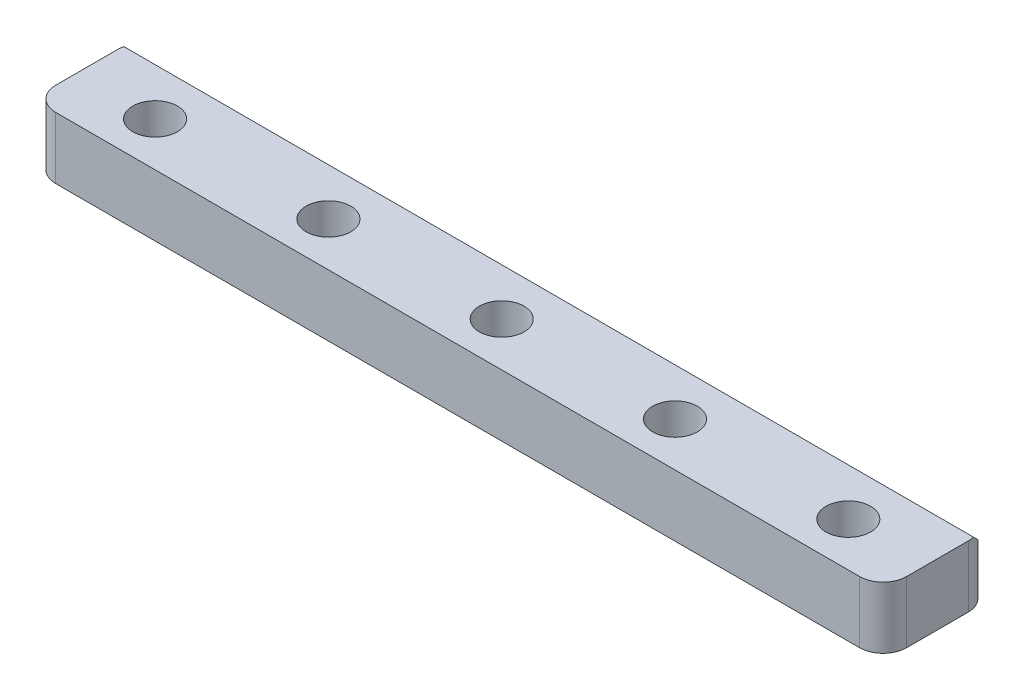
ISO-10303-21;
HEADER;
FILE_DESCRIPTION(('STEP AP214'),'2;1');
FILE_NAME('part.step','',(''),(''),'','','');
FILE_SCHEMA(('AUTOMOTIVE_DESIGN { 1 0 10303 214 1 1 1 1 }'));
ENDSEC;
DATA;
#1=APPLICATION_CONTEXT('core data for automotive mechanical design processes');
#2=APPLICATION_PROTOCOL_DEFINITION('international standard','automotive_design',2000,#1);
#3=PRODUCT_CONTEXT('',#1,'mechanical');
#4=PRODUCT('Part','Part','',(#3));
#5=PRODUCT_RELATED_PRODUCT_CATEGORY('part','',(#4));
#6=PRODUCT_DEFINITION_FORMATION('','',#4);
#7=PRODUCT_DEFINITION_CONTEXT('part definition',#1,'design');
#8=PRODUCT_DEFINITION('design','',#6,#7);
#9=PRODUCT_DEFINITION_SHAPE('','',#8);
#10=(LENGTH_UNIT() NAMED_UNIT(*) SI_UNIT(.MILLI.,.METRE.));
#11=(NAMED_UNIT(*) PLANE_ANGLE_UNIT() SI_UNIT($,.RADIAN.));
#12=(NAMED_UNIT(*) SI_UNIT($,.STERADIAN.) SOLID_ANGLE_UNIT());
#13=UNCERTAINTY_MEASURE_WITH_UNIT(LENGTH_MEASURE(1.E-05),#10,'distance_accuracy_value','');
#14=(GEOMETRIC_REPRESENTATION_CONTEXT(3) GLOBAL_UNCERTAINTY_ASSIGNED_CONTEXT((#13)) GLOBAL_UNIT_ASSIGNED_CONTEXT((#10,
#11,#12)) REPRESENTATION_CONTEXT('',''));
#15=CARTESIAN_POINT('',(0.,0.,0.));
#16=DIRECTION('',(0.,0.,1.));
#17=DIRECTION('',(1.,0.,0.));
#18=AXIS2_PLACEMENT_3D('',#15,#16,#17);
#19=CARTESIAN_POINT('',(34.2094010767586,5.25,-3.5));
#20=DIRECTION('',(0.,-1.,0.));
#21=DIRECTION('',(0.,0.,-1.));
#22=AXIS2_PLACEMENT_3D('',#19,#20,#21);
#23=PLANE('',#22);
#24=CARTESIAN_POINT('',(-14.7480762113533,5.25,0.));
#25=DIRECTION('',(0.,1.,0.));
#26=DIRECTION('',(0.,0.,1.));
#27=AXIS2_PLACEMENT_3D('',#24,#25,#26);
#28=CIRCLE('',#27,1.9);
#29=CARTESIAN_POINT('',(-14.7480762113533,5.25,-1.9));
#30=VERTEX_POINT('',#29);
#31=EDGE_CURVE('E343',#30,#30,#28,.T.);
#32=ORIENTED_EDGE('',*,*,#31,.F.);
#33=EDGE_LOOP('',(#32));
#34=FACE_BOUND('',#33,.T.);
#35=CARTESIAN_POINT('',(14.7480762113534,5.25,0.));
#36=DIRECTION('',(0.,1.,0.));
#37=DIRECTION('',(0.,0.,1.));
#38=AXIS2_PLACEMENT_3D('',#35,#36,#37);
#39=CIRCLE('',#38,1.9);
#40=CARTESIAN_POINT('',(14.7480762113534,5.25,-1.9));
#41=VERTEX_POINT('',#40);
#42=EDGE_CURVE('E362',#41,#41,#39,.T.);
#43=ORIENTED_EDGE('',*,*,#42,.F.);
#44=EDGE_LOOP('',(#43));
#45=FACE_BOUND('',#44,.T.);
#46=CARTESIAN_POINT('',(34.2094010767586,5.25,-3.5));
#47=DIRECTION('',(0.,1.,0.));
#48=DIRECTION('',(0.,0.,-1.));
#49=AXIS2_PLACEMENT_3D('',#46,#47,#48);
#50=CIRCLE('',#49,2.);
#51=CARTESIAN_POINT('',(36.2094010767586,5.25,-3.5));
#52=VERTEX_POINT('',#51);
#53=CARTESIAN_POINT('',(36.1458927498623,5.25,-4.00000000000001));
#54=VERTEX_POINT('',#53);
#55=EDGE_CURVE('E110',#52,#54,#50,.T.);
#56=ORIENTED_EDGE('',*,*,#55,.T.);
#57=DIRECTION('',(-1.,0.,0.));
#58=VECTOR('',#57,1.);
#59=CARTESIAN_POINT('',(34.2094010767586,5.25,-4.00000000000001));
#60=LINE('',#59,#58);
#61=CARTESIAN_POINT('',(-36.1458927498623,5.25,-4.));
#62=VERTEX_POINT('',#61);
#63=EDGE_CURVE('E109',#54,#62,#60,.T.);
#64=ORIENTED_EDGE('',*,*,#63,.T.);
#65=CARTESIAN_POINT('',(-34.2094010767586,5.25,-3.5));
#66=DIRECTION('',(0.,1.,0.));
#67=DIRECTION('',(0.,0.,1.));
#68=AXIS2_PLACEMENT_3D('',#65,#66,#67);
#69=CIRCLE('',#68,2.);
#70=CARTESIAN_POINT('',(-36.2094010767586,5.25,-3.5));
#71=VERTEX_POINT('',#70);
#72=EDGE_CURVE('E101',#62,#71,#69,.T.);
#73=ORIENTED_EDGE('',*,*,#72,.T.);
#74=DIRECTION('',(0.,0.,1.));
#75=VECTOR('',#74,1.);
#76=CARTESIAN_POINT('',(-36.2094010767586,5.25,-3.49999999999999));
#77=LINE('',#76,#75);
#78=CARTESIAN_POINT('',(-36.2094010767586,5.25,1.75));
#79=VERTEX_POINT('',#78);
#80=EDGE_CURVE('E106',#71,#79,#77,.T.);
#81=ORIENTED_EDGE('',*,*,#80,.T.);
#82=CARTESIAN_POINT('',(-34.2094010767586,5.25,1.75));
#83=DIRECTION('',(0.,1.,0.));
#84=DIRECTION('',(0.,0.,-1.));
#85=AXIS2_PLACEMENT_3D('',#82,#83,#84);
#86=CIRCLE('',#85,2.);
#87=CARTESIAN_POINT('',(-34.2094010767586,5.25,3.75));
#88=VERTEX_POINT('',#87);
#89=EDGE_CURVE('E125',#79,#88,#86,.T.);
#90=ORIENTED_EDGE('',*,*,#89,.T.);
#91=DIRECTION('',(1.,0.,0.));
#92=VECTOR('',#91,1.);
#93=CARTESIAN_POINT('',(-34.2094010767586,5.25,3.75));
#94=LINE('',#93,#92);
#95=CARTESIAN_POINT('',(34.2094010767586,5.25,3.75));
#96=VERTEX_POINT('',#95);
#97=EDGE_CURVE('E127',#88,#96,#94,.T.);
#98=ORIENTED_EDGE('',*,*,#97,.T.);
#99=CARTESIAN_POINT('',(34.2094010767586,5.25,1.75));
#100=DIRECTION('',(0.,1.,0.));
#101=DIRECTION('',(0.,0.,-1.));
#102=AXIS2_PLACEMENT_3D('',#99,#100,#101);
#103=CIRCLE('',#102,2.);
#104=CARTESIAN_POINT('',(36.2094010767586,5.25,1.75));
#105=VERTEX_POINT('',#104);
#106=EDGE_CURVE('E132',#96,#105,#103,.T.);
#107=ORIENTED_EDGE('',*,*,#106,.T.);
#108=DIRECTION('',(0.,0.,-1.));
#109=VECTOR('',#108,1.);
#110=CARTESIAN_POINT('',(36.2094010767586,5.25,-3.5));
#111=LINE('',#110,#109);
#112=EDGE_CURVE('E134',#105,#52,#111,.T.);
#113=ORIENTED_EDGE('',*,*,#112,.T.);
#114=EDGE_LOOP('',(#56,#64,#73,#81,#90,#98,#107,#113));
#115=FACE_BOUND('',#114,.T.);
#116=CARTESIAN_POINT('',(29.4980762113534,5.25,0.));
#117=DIRECTION('',(0.,1.,0.));
#118=DIRECTION('',(0.,0.,1.));
#119=AXIS2_PLACEMENT_3D('',#116,#117,#118);
#120=CIRCLE('',#119,1.9);
#121=CARTESIAN_POINT('',(29.4980762113534,5.25,-1.9));
#122=VERTEX_POINT('',#121);
#123=EDGE_CURVE('E141',#122,#122,#120,.T.);
#124=ORIENTED_EDGE('',*,*,#123,.F.);
#125=EDGE_LOOP('',(#124));
#126=FACE_BOUND('',#125,.T.);
#127=CARTESIAN_POINT('',(0.,5.25,0.));
#128=DIRECTION('',(0.,1.,0.));
#129=DIRECTION('',(0.,0.,1.));
#130=AXIS2_PLACEMENT_3D('',#127,#128,#129);
#131=CIRCLE('',#130,1.9);
#132=CARTESIAN_POINT('',(0.,5.25,-1.9));
#133=VERTEX_POINT('',#132);
#134=EDGE_CURVE('E356',#133,#133,#131,.T.);
#135=ORIENTED_EDGE('',*,*,#134,.F.);
#136=EDGE_LOOP('',(#135));
#137=FACE_BOUND('',#136,.T.);
#138=CARTESIAN_POINT('',(-29.4980762113533,5.25,0.));
#139=DIRECTION('',(0.,1.,0.));
#140=DIRECTION('',(0.,0.,1.));
#141=AXIS2_PLACEMENT_3D('',#138,#139,#140);
#142=CIRCLE('',#141,1.89999999999999);
#143=CARTESIAN_POINT('',(-29.4980762113533,5.25,-1.89999999999999));
#144=VERTEX_POINT('',#143);
#145=EDGE_CURVE('E347',#144,#144,#142,.T.);
#146=ORIENTED_EDGE('',*,*,#145,.F.);
#147=EDGE_LOOP('',(#146));
#148=FACE_BOUND('',#147,.T.);
#149=ADVANCED_FACE('F33',(#34,#45,#115,#126,#137,#148),#23,.F.);
#150=CARTESIAN_POINT('',(34.2094010767586,0.,-3.5));
#151=DIRECTION('',(0.,-1.,0.));
#152=DIRECTION('',(0.,0.,-1.));
#153=AXIS2_PLACEMENT_3D('',#150,#151,#152);
#154=PLANE('',#153);
#155=CARTESIAN_POINT('',(-14.7480762113533,0.,0.));
#156=DIRECTION('',(0.,1.,0.));
#157=DIRECTION('',(0.,0.,1.));
#158=AXIS2_PLACEMENT_3D('',#155,#156,#157);
#159=CIRCLE('',#158,1.9);
#160=CARTESIAN_POINT('',(-14.7480762113533,0.,-1.9));
#161=VERTEX_POINT('',#160);
#162=EDGE_CURVE('E346',#161,#161,#159,.T.);
#163=ORIENTED_EDGE('',*,*,#162,.T.);
#164=EDGE_LOOP('',(#163));
#165=FACE_BOUND('',#164,.T.);
#166=CARTESIAN_POINT('',(14.7480762113534,0.,0.));
#167=DIRECTION('',(0.,1.,0.));
#168=DIRECTION('',(0.,0.,1.));
#169=AXIS2_PLACEMENT_3D('',#166,#167,#168);
#170=CIRCLE('',#169,1.9);
#171=CARTESIAN_POINT('',(14.7480762113534,0.,-1.9));
#172=VERTEX_POINT('',#171);
#173=EDGE_CURVE('E359',#172,#172,#170,.T.);
#174=ORIENTED_EDGE('',*,*,#173,.T.);
#175=EDGE_LOOP('',(#174));
#176=FACE_BOUND('',#175,.T.);
#177=CARTESIAN_POINT('',(34.2094010767586,0.,-3.5));
#178=DIRECTION('',(0.,1.,0.));
#179=DIRECTION('',(0.,0.,-1.));
#180=AXIS2_PLACEMENT_3D('',#177,#178,#179);
#181=CIRCLE('',#180,2.);
#182=CARTESIAN_POINT('',(36.2094010767586,0.,-3.5));
#183=VERTEX_POINT('',#182);
#184=CARTESIAN_POINT('',(34.2094010767586,0.,-5.50000000000001));
#185=VERTEX_POINT('',#184);
#186=EDGE_CURVE('E137',#183,#185,#181,.T.);
#187=ORIENTED_EDGE('',*,*,#186,.F.);
#188=DIRECTION('',(0.,0.,-1.));
#189=VECTOR('',#188,1.);
#190=CARTESIAN_POINT('',(36.2094010767586,0.,-3.5));
#191=LINE('',#190,#189);
#192=CARTESIAN_POINT('',(36.2094010767586,0.,1.75));
#193=VERTEX_POINT('',#192);
#194=EDGE_CURVE('E153',#193,#183,#191,.T.);
#195=ORIENTED_EDGE('',*,*,#194,.F.);
#196=CARTESIAN_POINT('',(34.2094010767586,0.,1.75));
#197=DIRECTION('',(0.,1.,0.));
#198=DIRECTION('',(0.,0.,-1.));
#199=AXIS2_PLACEMENT_3D('',#196,#197,#198);
#200=CIRCLE('',#199,2.);
#201=CARTESIAN_POINT('',(34.2094010767586,0.,3.75));
#202=VERTEX_POINT('',#201);
#203=EDGE_CURVE('E151',#202,#193,#200,.T.);
#204=ORIENTED_EDGE('',*,*,#203,.F.);
#205=DIRECTION('',(1.,0.,0.));
#206=VECTOR('',#205,1.);
#207=CARTESIAN_POINT('',(-34.2094010767586,0.,3.75));
#208=LINE('',#207,#206);
#209=CARTESIAN_POINT('',(-34.2094010767586,0.,3.75));
#210=VERTEX_POINT('',#209);
#211=EDGE_CURVE('E149',#210,#202,#208,.T.);
#212=ORIENTED_EDGE('',*,*,#211,.F.);
#213=CARTESIAN_POINT('',(-34.2094010767586,0.,1.75));
#214=DIRECTION('',(0.,1.,0.));
#215=DIRECTION('',(0.,0.,-1.));
#216=AXIS2_PLACEMENT_3D('',#213,#214,#215);
#217=CIRCLE('',#216,2.);
#218=CARTESIAN_POINT('',(-36.2094010767586,0.,1.75));
#219=VERTEX_POINT('',#218);
#220=EDGE_CURVE('E147',#219,#210,#217,.T.);
#221=ORIENTED_EDGE('',*,*,#220,.F.);
#222=DIRECTION('',(0.,0.,1.));
#223=VECTOR('',#222,1.);
#224=CARTESIAN_POINT('',(-36.2094010767586,0.,-3.49999999999999));
#225=LINE('',#224,#223);
#226=CARTESIAN_POINT('',(-36.2094010767586,0.,-3.5));
#227=VERTEX_POINT('',#226);
#228=EDGE_CURVE('E145',#227,#219,#225,.T.);
#229=ORIENTED_EDGE('',*,*,#228,.F.);
#230=CARTESIAN_POINT('',(-34.2094010767586,0.,-3.5));
#231=DIRECTION('',(0.,1.,0.));
#232=DIRECTION('',(0.,0.,1.));
#233=AXIS2_PLACEMENT_3D('',#230,#231,#232);
#234=CIRCLE('',#233,2.);
#235=CARTESIAN_POINT('',(-34.2094010767586,0.,-5.5));
#236=VERTEX_POINT('',#235);
#237=EDGE_CURVE('E116',#236,#227,#234,.T.);
#238=ORIENTED_EDGE('',*,*,#237,.F.);
#239=DIRECTION('',(-1.,0.,0.));
#240=VECTOR('',#239,1.);
#241=CARTESIAN_POINT('',(34.2094010767586,0.,-5.50000000000001));
#242=LINE('',#241,#240);
#243=EDGE_CURVE('E140',#185,#236,#242,.T.);
#244=ORIENTED_EDGE('',*,*,#243,.F.);
#245=EDGE_LOOP('',(#187,#195,#204,#212,#221,#229,#238,#244));
#246=FACE_BOUND('',#245,.T.);
#247=CARTESIAN_POINT('',(29.4980762113534,0.,0.));
#248=DIRECTION('',(0.,1.,0.));
#249=DIRECTION('',(0.,0.,1.));
#250=AXIS2_PLACEMENT_3D('',#247,#248,#249);
#251=CIRCLE('',#250,1.9);
#252=CARTESIAN_POINT('',(29.4980762113534,0.,-1.9));
#253=VERTEX_POINT('',#252);
#254=EDGE_CURVE('E365',#253,#253,#251,.T.);
#255=ORIENTED_EDGE('',*,*,#254,.T.);
#256=EDGE_LOOP('',(#255));
#257=FACE_BOUND('',#256,.T.);
#258=CARTESIAN_POINT('',(0.,0.,0.));
#259=DIRECTION('',(0.,1.,0.));
#260=DIRECTION('',(0.,0.,1.));
#261=AXIS2_PLACEMENT_3D('',#258,#259,#260);
#262=CIRCLE('',#261,1.9);
#263=CARTESIAN_POINT('',(0.,0.,-1.9));
#264=VERTEX_POINT('',#263);
#265=EDGE_CURVE('E349',#264,#264,#262,.T.);
#266=ORIENTED_EDGE('',*,*,#265,.T.);
#267=EDGE_LOOP('',(#266));
#268=FACE_BOUND('',#267,.T.);
#269=CARTESIAN_POINT('',(-29.4980762113533,0.,0.));
#270=DIRECTION('',(0.,1.,0.));
#271=DIRECTION('',(0.,0.,1.));
#272=AXIS2_PLACEMENT_3D('',#269,#270,#271);
#273=CIRCLE('',#272,1.89999999999999);
#274=CARTESIAN_POINT('',(-29.4980762113533,0.,-1.89999999999999));
#275=VERTEX_POINT('',#274);
#276=EDGE_CURVE('E352',#275,#275,#273,.T.);
#277=ORIENTED_EDGE('',*,*,#276,.T.);
#278=EDGE_LOOP('',(#277));
#279=FACE_BOUND('',#278,.T.);
#280=ADVANCED_FACE('F177',(#165,#176,#246,#257,#268,#279),#154,.T.);
#281=CARTESIAN_POINT('',(34.2094010767586,5.25,-3.5));
#282=DIRECTION('',(0.,-1.,0.));
#283=DIRECTION('',(0.,0.,-1.));
#284=AXIS2_PLACEMENT_3D('',#281,#282,#283);
#285=CYLINDRICAL_SURFACE('',#284,2.);
#286=DIRECTION('',(0.,-1.,0.));
#287=VECTOR('',#286,1.);
#288=CARTESIAN_POINT('',(34.2094010767586,5.25,-5.50000000000001));
#289=LINE('',#288,#287);
#290=CARTESIAN_POINT('',(34.2094010767586,3.75000000000001,-5.50000000000001));
#291=VERTEX_POINT('',#290);
#292=EDGE_CURVE('E168',#291,#185,#289,.T.);
#293=ORIENTED_EDGE('',*,*,#292,.F.);
#294=CARTESIAN_POINT('',(34.2094010767586,5.75000000000001,-3.5));
#295=DIRECTION('',(0.,-0.707106781186548,0.707106781186548));
#296=DIRECTION('',(0.,-0.707106781186548,-0.707106781186548));
#297=AXIS2_PLACEMENT_3D('',#294,#295,#296);
#298=ELLIPSE('',#297,2.82842712474619,2.);
#299=EDGE_CURVE('E11',#291,#54,#298,.T.);
#300=ORIENTED_EDGE('',*,*,#299,.T.);
#301=ORIENTED_EDGE('',*,*,#55,.F.);
#302=DIRECTION('',(0.,-1.,0.));
#303=VECTOR('',#302,1.);
#304=CARTESIAN_POINT('',(36.2094010767586,5.25,-3.5));
#305=LINE('',#304,#303);
#306=EDGE_CURVE('E136',#52,#183,#305,.T.);
#307=ORIENTED_EDGE('',*,*,#306,.T.);
#308=ORIENTED_EDGE('',*,*,#186,.T.);
#309=EDGE_LOOP('',(#293,#300,#301,#307,#308));
#310=FACE_BOUND('',#309,.T.);
#311=ADVANCED_FACE('F180',(#310),#285,.T.);
#312=CARTESIAN_POINT('',(34.2094010767586,5.25,-5.50000000000001));
#313=DIRECTION('',(0.,0.,1.));
#314=DIRECTION('',(1.,0.,0.));
#315=AXIS2_PLACEMENT_3D('',#312,#313,#314);
#316=PLANE('',#315);
#317=DIRECTION('',(0.,-1.,0.));
#318=VECTOR('',#317,1.);
#319=CARTESIAN_POINT('',(-34.2094010767586,5.25,-5.5));
#320=LINE('',#319,#318);
#321=CARTESIAN_POINT('',(-34.2094010767586,3.75000000000001,-5.5));
#322=VERTEX_POINT('',#321);
#323=EDGE_CURVE('E119',#322,#236,#320,.T.);
#324=ORIENTED_EDGE('',*,*,#323,.F.);
#325=DIRECTION('',(1.,0.,0.));
#326=VECTOR('',#325,1.);
#327=CARTESIAN_POINT('',(34.2094010767586,3.75000000000001,-5.50000000000001));
#328=LINE('',#327,#326);
#329=EDGE_CURVE('E41',#322,#291,#328,.T.);
#330=ORIENTED_EDGE('',*,*,#329,.T.);
#331=ORIENTED_EDGE('',*,*,#292,.T.);
#332=ORIENTED_EDGE('',*,*,#243,.T.);
#333=EDGE_LOOP('',(#324,#330,#331,#332));
#334=FACE_BOUND('',#333,.T.);
#335=ADVANCED_FACE('F172',(#334),#316,.F.);
#336=CARTESIAN_POINT('',(-34.2094010767586,5.25,-3.5));
#337=DIRECTION('',(0.,-1.,0.));
#338=DIRECTION('',(0.,0.,-1.));
#339=AXIS2_PLACEMENT_3D('',#336,#337,#338);
#340=CYLINDRICAL_SURFACE('',#339,2.);
#341=ORIENTED_EDGE('',*,*,#72,.F.);
#342=CARTESIAN_POINT('',(-34.2094010767586,5.75000000000001,-3.5));
#343=DIRECTION('',(0.,-0.707106781186548,0.707106781186548));
#344=DIRECTION('',(0.,-0.707106781186548,-0.707106781186548));
#345=AXIS2_PLACEMENT_3D('',#342,#343,#344);
#346=ELLIPSE('',#345,2.82842712474619,2.);
#347=EDGE_CURVE('E55',#62,#322,#346,.T.);
#348=ORIENTED_EDGE('',*,*,#347,.T.);
#349=ORIENTED_EDGE('',*,*,#323,.T.);
#350=ORIENTED_EDGE('',*,*,#237,.T.);
#351=DIRECTION('',(0.,-1.,0.));
#352=VECTOR('',#351,1.);
#353=CARTESIAN_POINT('',(-36.2094010767586,5.25,-3.5));
#354=LINE('',#353,#352);
#355=EDGE_CURVE('E113',#71,#227,#354,.T.);
#356=ORIENTED_EDGE('',*,*,#355,.F.);
#357=EDGE_LOOP('',(#341,#348,#349,#350,#356));
#358=FACE_BOUND('',#357,.T.);
#359=ADVANCED_FACE('F114',(#358),#340,.T.);
#360=CARTESIAN_POINT('',(-36.2094010767586,5.25,-3.49999999999999));
#361=DIRECTION('',(1.,0.,0.));
#362=DIRECTION('',(0.,0.,-1.));
#363=AXIS2_PLACEMENT_3D('',#360,#361,#362);
#364=PLANE('',#363);
#365=ORIENTED_EDGE('',*,*,#228,.T.);
#366=DIRECTION('',(0.,-1.,0.));
#367=VECTOR('',#366,1.);
#368=CARTESIAN_POINT('',(-36.2094010767586,5.25,1.75));
#369=LINE('',#368,#367);
#370=EDGE_CURVE('E120',#79,#219,#369,.T.);
#371=ORIENTED_EDGE('',*,*,#370,.F.);
#372=ORIENTED_EDGE('',*,*,#80,.F.);
#373=ORIENTED_EDGE('',*,*,#355,.T.);
#374=EDGE_LOOP('',(#365,#371,#372,#373));
#375=FACE_BOUND('',#374,.T.);
#376=ADVANCED_FACE('F122',(#375),#364,.F.);
#377=CARTESIAN_POINT('',(-34.2094010767586,5.25,1.75));
#378=DIRECTION('',(0.,-1.,0.));
#379=DIRECTION('',(0.,0.,-1.));
#380=AXIS2_PLACEMENT_3D('',#377,#378,#379);
#381=CYLINDRICAL_SURFACE('',#380,2.);
#382=ORIENTED_EDGE('',*,*,#220,.T.);
#383=DIRECTION('',(0.,-1.,0.));
#384=VECTOR('',#383,1.);
#385=CARTESIAN_POINT('',(-34.2094010767586,5.25,3.75));
#386=LINE('',#385,#384);
#387=EDGE_CURVE('E163',#88,#210,#386,.T.);
#388=ORIENTED_EDGE('',*,*,#387,.F.);
#389=ORIENTED_EDGE('',*,*,#89,.F.);
#390=ORIENTED_EDGE('',*,*,#370,.T.);
#391=EDGE_LOOP('',(#382,#388,#389,#390));
#392=FACE_BOUND('',#391,.T.);
#393=ADVANCED_FACE('F199',(#392),#381,.T.);
#394=CARTESIAN_POINT('',(-34.2094010767586,5.25,3.75));
#395=DIRECTION('',(0.,0.,-1.));
#396=DIRECTION('',(-1.,0.,0.));
#397=AXIS2_PLACEMENT_3D('',#394,#395,#396);
#398=PLANE('',#397);
#399=ORIENTED_EDGE('',*,*,#211,.T.);
#400=DIRECTION('',(0.,-1.,0.));
#401=VECTOR('',#400,1.);
#402=CARTESIAN_POINT('',(34.2094010767586,5.25,3.75));
#403=LINE('',#402,#401);
#404=EDGE_CURVE('E160',#96,#202,#403,.T.);
#405=ORIENTED_EDGE('',*,*,#404,.F.);
#406=ORIENTED_EDGE('',*,*,#97,.F.);
#407=ORIENTED_EDGE('',*,*,#387,.T.);
#408=EDGE_LOOP('',(#399,#405,#406,#407));
#409=FACE_BOUND('',#408,.T.);
#410=ADVANCED_FACE('F196',(#409),#398,.F.);
#411=CARTESIAN_POINT('',(34.2094010767586,5.25,1.75));
#412=DIRECTION('',(0.,-1.,0.));
#413=DIRECTION('',(0.,0.,-1.));
#414=AXIS2_PLACEMENT_3D('',#411,#412,#413);
#415=CYLINDRICAL_SURFACE('',#414,2.);
#416=ORIENTED_EDGE('',*,*,#203,.T.);
#417=DIRECTION('',(0.,-1.,0.));
#418=VECTOR('',#417,1.);
#419=CARTESIAN_POINT('',(36.2094010767586,5.25,1.75));
#420=LINE('',#419,#418);
#421=EDGE_CURVE('E157',#105,#193,#420,.T.);
#422=ORIENTED_EDGE('',*,*,#421,.F.);
#423=ORIENTED_EDGE('',*,*,#106,.F.);
#424=ORIENTED_EDGE('',*,*,#404,.T.);
#425=EDGE_LOOP('',(#416,#422,#423,#424));
#426=FACE_BOUND('',#425,.T.);
#427=ADVANCED_FACE('F191',(#426),#415,.T.);
#428=CARTESIAN_POINT('',(36.2094010767586,5.25,-3.5));
#429=DIRECTION('',(-1.,0.,0.));
#430=DIRECTION('',(0.,0.,1.));
#431=AXIS2_PLACEMENT_3D('',#428,#429,#430);
#432=PLANE('',#431);
#433=ORIENTED_EDGE('',*,*,#194,.T.);
#434=ORIENTED_EDGE('',*,*,#306,.F.);
#435=ORIENTED_EDGE('',*,*,#112,.F.);
#436=ORIENTED_EDGE('',*,*,#421,.T.);
#437=EDGE_LOOP('',(#433,#434,#435,#436));
#438=FACE_BOUND('',#437,.T.);
#439=ADVANCED_FACE('F185',(#438),#432,.F.);
#440=CARTESIAN_POINT('',(29.4980762113534,5.25,0.));
#441=DIRECTION('',(0.,-1.,0.));
#442=DIRECTION('',(0.,0.,-1.));
#443=AXIS2_PLACEMENT_3D('',#440,#441,#442);
#444=CYLINDRICAL_SURFACE('',#443,1.9);
#445=CARTESIAN_POINT('',(29.4980762113534,5.25,-1.9));
#446=CARTESIAN_POINT('',(29.4980762113534,5.1953125,-1.9));
#447=CARTESIAN_POINT('',(29.4980762113534,5.140625,-1.9));
#448=CARTESIAN_POINT('',(29.4980762113534,5.03125,-1.9));
#449=CARTESIAN_POINT('',(29.4980762113534,4.9765625,-1.9));
#450=CARTESIAN_POINT('',(29.4980762113534,4.8671875,-1.9));
#451=CARTESIAN_POINT('',(29.4980762113534,4.8125,-1.9));
#452=CARTESIAN_POINT('',(29.4980762113534,4.703125,-1.9));
#453=CARTESIAN_POINT('',(29.4980762113534,4.6484375,-1.9));
#454=CARTESIAN_POINT('',(29.4980762113534,4.5390625,-1.9));
#455=CARTESIAN_POINT('',(29.4980762113534,4.484375,-1.9));
#456=CARTESIAN_POINT('',(29.4980762113534,4.375,-1.9));
#457=CARTESIAN_POINT('',(29.4980762113534,4.3203125,-1.9));
#458=CARTESIAN_POINT('',(29.4980762113534,4.2109375,-1.9));
#459=CARTESIAN_POINT('',(29.4980762113534,4.15625,-1.9));
#460=CARTESIAN_POINT('',(29.4980762113534,4.046875,-1.9));
#461=CARTESIAN_POINT('',(29.4980762113534,3.9921875,-1.9));
#462=CARTESIAN_POINT('',(29.4980762113534,3.8828125,-1.9));
#463=CARTESIAN_POINT('',(29.4980762113534,3.828125,-1.9));
#464=CARTESIAN_POINT('',(29.4980762113534,3.71875,-1.9));
#465=CARTESIAN_POINT('',(29.4980762113534,3.6640625,-1.9));
#466=CARTESIAN_POINT('',(29.4980762113534,3.5546875,-1.9));
#467=CARTESIAN_POINT('',(29.4980762113534,3.5,-1.9));
#468=CARTESIAN_POINT('',(29.4980762113534,3.390625,-1.9));
#469=CARTESIAN_POINT('',(29.4980762113534,3.3359375,-1.9));
#470=CARTESIAN_POINT('',(29.4980762113534,3.2265625,-1.9));
#471=CARTESIAN_POINT('',(29.4980762113534,3.171875,-1.9));
#472=CARTESIAN_POINT('',(29.4980762113534,3.0625,-1.9));
#473=CARTESIAN_POINT('',(29.4980762113534,3.0078125,-1.9));
#474=CARTESIAN_POINT('',(29.4980762113534,2.8984375,-1.9));
#475=CARTESIAN_POINT('',(29.4980762113534,2.84375,-1.9));
#476=CARTESIAN_POINT('',(29.4980762113534,2.734375,-1.9));
#477=CARTESIAN_POINT('',(29.4980762113534,2.6796875,-1.9));
#478=CARTESIAN_POINT('',(29.4980762113534,2.5703125,-1.9));
#479=CARTESIAN_POINT('',(29.4980762113534,2.515625,-1.9));
#480=CARTESIAN_POINT('',(29.4980762113534,2.40625,-1.9));
#481=CARTESIAN_POINT('',(29.4980762113534,2.3515625,-1.9));
#482=CARTESIAN_POINT('',(29.4980762113534,2.2421875,-1.9));
#483=CARTESIAN_POINT('',(29.4980762113534,2.1875,-1.9));
#484=CARTESIAN_POINT('',(29.4980762113534,2.078125,-1.9));
#485=CARTESIAN_POINT('',(29.4980762113534,2.0234375,-1.9));
#486=CARTESIAN_POINT('',(29.4980762113534,1.9140625,-1.9));
#487=CARTESIAN_POINT('',(29.4980762113534,1.859375,-1.9));
#488=CARTESIAN_POINT('',(29.4980762113534,1.75,-1.9));
#489=CARTESIAN_POINT('',(29.4980762113534,1.6953125,-1.9));
#490=CARTESIAN_POINT('',(29.4980762113534,1.5859375,-1.9));
#491=CARTESIAN_POINT('',(29.4980762113534,1.53125,-1.9));
#492=CARTESIAN_POINT('',(29.4980762113534,1.421875,-1.9));
#493=CARTESIAN_POINT('',(29.4980762113534,1.3671875,-1.9));
#494=CARTESIAN_POINT('',(29.4980762113534,1.2578125,-1.9));
#495=CARTESIAN_POINT('',(29.4980762113534,1.203125,-1.9));
#496=CARTESIAN_POINT('',(29.4980762113534,1.09375,-1.9));
#497=CARTESIAN_POINT('',(29.4980762113534,1.0390625,-1.9));
#498=CARTESIAN_POINT('',(29.4980762113534,0.9296875,-1.9));
#499=CARTESIAN_POINT('',(29.4980762113534,0.875,-1.9));
#500=CARTESIAN_POINT('',(29.4980762113534,0.765625,-1.9));
#501=CARTESIAN_POINT('',(29.4980762113534,0.7109375,-1.9));
#502=CARTESIAN_POINT('',(29.4980762113534,0.601562500000001,-1.9));
#503=CARTESIAN_POINT('',(29.4980762113534,0.546875,-1.9));
#504=CARTESIAN_POINT('',(29.4980762113534,0.4375,-1.9));
#505=CARTESIAN_POINT('',(29.4980762113534,0.3828125,-1.9));
#506=CARTESIAN_POINT('',(29.4980762113534,0.2734375,-1.9));
#507=CARTESIAN_POINT('',(29.4980762113534,0.21875,-1.9));
#508=CARTESIAN_POINT('',(29.4980762113534,0.109375,-1.9));
#509=CARTESIAN_POINT('',(29.4980762113534,0.0546875,-1.9));
#510=CARTESIAN_POINT('',(29.4980762113534,0.,-1.9));
#511=B_SPLINE_CURVE_WITH_KNOTS('',3,(#445,#446,#447,#448,#449,#450,#451,#452,#453,#454,#455,
#456,#457,#458,#459,#460,#461,#462,#463,#464,#465,#466,#467,#468,#469,#470,#471,#472,#473,#474,
#475,#476,#477,#478,#479,#480,#481,#482,#483,#484,#485,#486,#487,#488,#489,#490,#491,#492,#493,
#494,#495,#496,#497,#498,#499,#500,#501,#502,#503,#504,#505,#506,#507,#508,#509,#510),
.UNSPECIFIED.,.F.,.F.,(4,2,2,2,2,2,2,2,2,2,2,2,2,2,2,2,2,2,2,2,2,2,2,2,2,2,2,2,2,2,2,2,4),(0.,
0.1640625,0.328125,0.4921875,0.656250000000001,0.820312500000001,0.984375,1.1484375,1.3125,
1.4765625,1.640625,1.8046875,1.96875,2.1328125,2.296875,2.4609375,2.625,2.7890625,2.953125,
3.1171875,3.28125,3.4453125,3.609375,3.7734375,3.9375,4.1015625,4.265625,4.4296875,4.59375,
4.7578125,4.921875,5.0859375,5.25),.UNSPECIFIED.);
#512=EDGE_CURVE('BSEAM220',#122,#253,#511,.T.);
#513=ORIENTED_EDGE('',*,*,#123,.T.);
#514=ORIENTED_EDGE('',*,*,#254,.F.);
#515=ORIENTED_EDGE('',*,*,#512,.T.);
#516=ORIENTED_EDGE('',*,*,#512,.F.);
#517=EDGE_LOOP('',(#513,#515,#514,#516));
#518=FACE_BOUND('',#517,.T.);
#519=ADVANCED_FACE('F220',(#518),#444,.F.);
#520=CARTESIAN_POINT('',(14.7480762113534,5.25,0.));
#521=DIRECTION('',(0.,-1.,0.));
#522=DIRECTION('',(0.,0.,-1.));
#523=AXIS2_PLACEMENT_3D('',#520,#521,#522);
#524=CYLINDRICAL_SURFACE('',#523,1.9);
#525=CARTESIAN_POINT('',(14.7480762113534,5.25,-1.9));
#526=CARTESIAN_POINT('',(14.7480762113534,5.1953125,-1.9));
#527=CARTESIAN_POINT('',(14.7480762113534,5.140625,-1.9));
#528=CARTESIAN_POINT('',(14.7480762113534,5.03125,-1.9));
#529=CARTESIAN_POINT('',(14.7480762113534,4.9765625,-1.9));
#530=CARTESIAN_POINT('',(14.7480762113534,4.8671875,-1.9));
#531=CARTESIAN_POINT('',(14.7480762113534,4.8125,-1.9));
#532=CARTESIAN_POINT('',(14.7480762113534,4.703125,-1.9));
#533=CARTESIAN_POINT('',(14.7480762113534,4.6484375,-1.9));
#534=CARTESIAN_POINT('',(14.7480762113534,4.5390625,-1.9));
#535=CARTESIAN_POINT('',(14.7480762113534,4.484375,-1.9));
#536=CARTESIAN_POINT('',(14.7480762113534,4.375,-1.9));
#537=CARTESIAN_POINT('',(14.7480762113534,4.3203125,-1.9));
#538=CARTESIAN_POINT('',(14.7480762113534,4.2109375,-1.9));
#539=CARTESIAN_POINT('',(14.7480762113534,4.15625,-1.9));
#540=CARTESIAN_POINT('',(14.7480762113534,4.046875,-1.9));
#541=CARTESIAN_POINT('',(14.7480762113534,3.9921875,-1.9));
#542=CARTESIAN_POINT('',(14.7480762113534,3.8828125,-1.9));
#543=CARTESIAN_POINT('',(14.7480762113534,3.828125,-1.9));
#544=CARTESIAN_POINT('',(14.7480762113534,3.71875,-1.9));
#545=CARTESIAN_POINT('',(14.7480762113534,3.6640625,-1.9));
#546=CARTESIAN_POINT('',(14.7480762113534,3.5546875,-1.9));
#547=CARTESIAN_POINT('',(14.7480762113534,3.5,-1.9));
#548=CARTESIAN_POINT('',(14.7480762113534,3.390625,-1.9));
#549=CARTESIAN_POINT('',(14.7480762113534,3.3359375,-1.9));
#550=CARTESIAN_POINT('',(14.7480762113534,3.2265625,-1.9));
#551=CARTESIAN_POINT('',(14.7480762113534,3.171875,-1.9));
#552=CARTESIAN_POINT('',(14.7480762113534,3.0625,-1.9));
#553=CARTESIAN_POINT('',(14.7480762113534,3.0078125,-1.9));
#554=CARTESIAN_POINT('',(14.7480762113534,2.8984375,-1.9));
#555=CARTESIAN_POINT('',(14.7480762113534,2.84375,-1.9));
#556=CARTESIAN_POINT('',(14.7480762113534,2.734375,-1.9));
#557=CARTESIAN_POINT('',(14.7480762113534,2.6796875,-1.9));
#558=CARTESIAN_POINT('',(14.7480762113534,2.5703125,-1.9));
#559=CARTESIAN_POINT('',(14.7480762113534,2.515625,-1.9));
#560=CARTESIAN_POINT('',(14.7480762113534,2.40625,-1.9));
#561=CARTESIAN_POINT('',(14.7480762113534,2.3515625,-1.9));
#562=CARTESIAN_POINT('',(14.7480762113534,2.2421875,-1.9));
#563=CARTESIAN_POINT('',(14.7480762113534,2.1875,-1.9));
#564=CARTESIAN_POINT('',(14.7480762113534,2.078125,-1.9));
#565=CARTESIAN_POINT('',(14.7480762113534,2.0234375,-1.9));
#566=CARTESIAN_POINT('',(14.7480762113534,1.9140625,-1.9));
#567=CARTESIAN_POINT('',(14.7480762113534,1.859375,-1.9));
#568=CARTESIAN_POINT('',(14.7480762113534,1.75,-1.9));
#569=CARTESIAN_POINT('',(14.7480762113534,1.6953125,-1.9));
#570=CARTESIAN_POINT('',(14.7480762113534,1.5859375,-1.9));
#571=CARTESIAN_POINT('',(14.7480762113534,1.53125,-1.9));
#572=CARTESIAN_POINT('',(14.7480762113534,1.421875,-1.9));
#573=CARTESIAN_POINT('',(14.7480762113534,1.3671875,-1.9));
#574=CARTESIAN_POINT('',(14.7480762113534,1.2578125,-1.9));
#575=CARTESIAN_POINT('',(14.7480762113534,1.203125,-1.9));
#576=CARTESIAN_POINT('',(14.7480762113534,1.09375,-1.9));
#577=CARTESIAN_POINT('',(14.7480762113534,1.0390625,-1.9));
#578=CARTESIAN_POINT('',(14.7480762113534,0.9296875,-1.9));
#579=CARTESIAN_POINT('',(14.7480762113534,0.875,-1.9));
#580=CARTESIAN_POINT('',(14.7480762113534,0.765625,-1.9));
#581=CARTESIAN_POINT('',(14.7480762113534,0.7109375,-1.9));
#582=CARTESIAN_POINT('',(14.7480762113534,0.601562500000001,-1.9));
#583=CARTESIAN_POINT('',(14.7480762113534,0.546875,-1.9));
#584=CARTESIAN_POINT('',(14.7480762113534,0.4375,-1.9));
#585=CARTESIAN_POINT('',(14.7480762113534,0.3828125,-1.9));
#586=CARTESIAN_POINT('',(14.7480762113534,0.2734375,-1.9));
#587=CARTESIAN_POINT('',(14.7480762113534,0.21875,-1.9));
#588=CARTESIAN_POINT('',(14.7480762113534,0.109375,-1.9));
#589=CARTESIAN_POINT('',(14.7480762113534,0.0546875,-1.9));
#590=CARTESIAN_POINT('',(14.7480762113534,0.,-1.9));
#591=B_SPLINE_CURVE_WITH_KNOTS('',3,(#525,#526,#527,#528,#529,#530,#531,#532,#533,#534,#535,
#536,#537,#538,#539,#540,#541,#542,#543,#544,#545,#546,#547,#548,#549,#550,#551,#552,#553,#554,
#555,#556,#557,#558,#559,#560,#561,#562,#563,#564,#565,#566,#567,#568,#569,#570,#571,#572,#573,
#574,#575,#576,#577,#578,#579,#580,#581,#582,#583,#584,#585,#586,#587,#588,#589,#590),
.UNSPECIFIED.,.F.,.F.,(4,2,2,2,2,2,2,2,2,2,2,2,2,2,2,2,2,2,2,2,2,2,2,2,2,2,2,2,2,2,2,2,4),(0.,
0.1640625,0.328125,0.4921875,0.656250000000001,0.820312500000001,0.984375,1.1484375,1.3125,
1.4765625,1.640625,1.8046875,1.96875,2.1328125,2.296875,2.4609375,2.625,2.7890625,2.953125,
3.1171875,3.28125,3.4453125,3.609375,3.7734375,3.9375,4.1015625,4.265625,4.4296875,4.59375,
4.7578125,4.921875,5.0859375,5.25),.UNSPECIFIED.);
#592=EDGE_CURVE('BSEAM275',#41,#172,#591,.T.);
#593=ORIENTED_EDGE('',*,*,#42,.T.);
#594=ORIENTED_EDGE('',*,*,#173,.F.);
#595=ORIENTED_EDGE('',*,*,#592,.T.);
#596=ORIENTED_EDGE('',*,*,#592,.F.);
#597=EDGE_LOOP('',(#593,#595,#594,#596));
#598=FACE_BOUND('',#597,.T.);
#599=ADVANCED_FACE('F275',(#598),#524,.F.);
#600=CARTESIAN_POINT('',(0.,5.25,0.));
#601=DIRECTION('',(0.,-1.,0.));
#602=DIRECTION('',(0.,0.,-1.));
#603=AXIS2_PLACEMENT_3D('',#600,#601,#602);
#604=CYLINDRICAL_SURFACE('',#603,1.9);
#605=CARTESIAN_POINT('',(0.,5.25,-1.9));
#606=CARTESIAN_POINT('',(0.,5.1953125,-1.9));
#607=CARTESIAN_POINT('',(0.,5.140625,-1.9));
#608=CARTESIAN_POINT('',(0.,5.03125,-1.9));
#609=CARTESIAN_POINT('',(0.,4.9765625,-1.9));
#610=CARTESIAN_POINT('',(0.,4.8671875,-1.9));
#611=CARTESIAN_POINT('',(0.,4.8125,-1.9));
#612=CARTESIAN_POINT('',(0.,4.703125,-1.9));
#613=CARTESIAN_POINT('',(0.,4.6484375,-1.9));
#614=CARTESIAN_POINT('',(0.,4.5390625,-1.9));
#615=CARTESIAN_POINT('',(0.,4.484375,-1.9));
#616=CARTESIAN_POINT('',(0.,4.375,-1.9));
#617=CARTESIAN_POINT('',(0.,4.3203125,-1.9));
#618=CARTESIAN_POINT('',(0.,4.2109375,-1.9));
#619=CARTESIAN_POINT('',(0.,4.15625,-1.9));
#620=CARTESIAN_POINT('',(0.,4.046875,-1.9));
#621=CARTESIAN_POINT('',(0.,3.9921875,-1.9));
#622=CARTESIAN_POINT('',(0.,3.8828125,-1.9));
#623=CARTESIAN_POINT('',(0.,3.828125,-1.9));
#624=CARTESIAN_POINT('',(0.,3.71875,-1.9));
#625=CARTESIAN_POINT('',(0.,3.6640625,-1.9));
#626=CARTESIAN_POINT('',(0.,3.5546875,-1.9));
#627=CARTESIAN_POINT('',(0.,3.5,-1.9));
#628=CARTESIAN_POINT('',(0.,3.390625,-1.9));
#629=CARTESIAN_POINT('',(0.,3.3359375,-1.9));
#630=CARTESIAN_POINT('',(0.,3.2265625,-1.9));
#631=CARTESIAN_POINT('',(0.,3.171875,-1.9));
#632=CARTESIAN_POINT('',(0.,3.0625,-1.9));
#633=CARTESIAN_POINT('',(0.,3.0078125,-1.9));
#634=CARTESIAN_POINT('',(0.,2.8984375,-1.9));
#635=CARTESIAN_POINT('',(0.,2.84375,-1.9));
#636=CARTESIAN_POINT('',(0.,2.734375,-1.9));
#637=CARTESIAN_POINT('',(0.,2.6796875,-1.9));
#638=CARTESIAN_POINT('',(0.,2.5703125,-1.9));
#639=CARTESIAN_POINT('',(0.,2.515625,-1.9));
#640=CARTESIAN_POINT('',(0.,2.40625,-1.9));
#641=CARTESIAN_POINT('',(0.,2.3515625,-1.9));
#642=CARTESIAN_POINT('',(0.,2.2421875,-1.9));
#643=CARTESIAN_POINT('',(0.,2.1875,-1.9));
#644=CARTESIAN_POINT('',(0.,2.078125,-1.9));
#645=CARTESIAN_POINT('',(0.,2.0234375,-1.9));
#646=CARTESIAN_POINT('',(0.,1.9140625,-1.9));
#647=CARTESIAN_POINT('',(0.,1.859375,-1.9));
#648=CARTESIAN_POINT('',(0.,1.75,-1.9));
#649=CARTESIAN_POINT('',(0.,1.6953125,-1.9));
#650=CARTESIAN_POINT('',(0.,1.5859375,-1.9));
#651=CARTESIAN_POINT('',(0.,1.53125,-1.9));
#652=CARTESIAN_POINT('',(0.,1.421875,-1.9));
#653=CARTESIAN_POINT('',(0.,1.3671875,-1.9));
#654=CARTESIAN_POINT('',(0.,1.2578125,-1.9));
#655=CARTESIAN_POINT('',(0.,1.203125,-1.9));
#656=CARTESIAN_POINT('',(0.,1.09375,-1.9));
#657=CARTESIAN_POINT('',(0.,1.0390625,-1.9));
#658=CARTESIAN_POINT('',(0.,0.9296875,-1.9));
#659=CARTESIAN_POINT('',(0.,0.875,-1.9));
#660=CARTESIAN_POINT('',(0.,0.765625,-1.9));
#661=CARTESIAN_POINT('',(0.,0.7109375,-1.9));
#662=CARTESIAN_POINT('',(0.,0.601562500000001,-1.9));
#663=CARTESIAN_POINT('',(0.,0.546875,-1.9));
#664=CARTESIAN_POINT('',(0.,0.4375,-1.9));
#665=CARTESIAN_POINT('',(0.,0.3828125,-1.9));
#666=CARTESIAN_POINT('',(0.,0.2734375,-1.9));
#667=CARTESIAN_POINT('',(0.,0.21875,-1.9));
#668=CARTESIAN_POINT('',(0.,0.109375,-1.9));
#669=CARTESIAN_POINT('',(0.,0.0546875,-1.9));
#670=CARTESIAN_POINT('',(0.,0.,-1.9));
#671=B_SPLINE_CURVE_WITH_KNOTS('',3,(#605,#606,#607,#608,#609,#610,#611,#612,#613,#614,#615,
#616,#617,#618,#619,#620,#621,#622,#623,#624,#625,#626,#627,#628,#629,#630,#631,#632,#633,#634,
#635,#636,#637,#638,#639,#640,#641,#642,#643,#644,#645,#646,#647,#648,#649,#650,#651,#652,#653,
#654,#655,#656,#657,#658,#659,#660,#661,#662,#663,#664,#665,#666,#667,#668,#669,#670),
.UNSPECIFIED.,.F.,.F.,(4,2,2,2,2,2,2,2,2,2,2,2,2,2,2,2,2,2,2,2,2,2,2,2,2,2,2,2,2,2,2,2,4),(0.,
0.1640625,0.328125,0.4921875,0.656250000000001,0.820312500000001,0.984375,1.1484375,1.3125,
1.4765625,1.640625,1.8046875,1.96875,2.1328125,2.296875,2.4609375,2.625,2.7890625,2.953125,
3.1171875,3.28125,3.4453125,3.609375,3.7734375,3.9375,4.1015625,4.265625,4.4296875,4.59375,
4.7578125,4.921875,5.0859375,5.25),.UNSPECIFIED.);
#672=EDGE_CURVE('BSEAM282',#133,#264,#671,.T.);
#673=ORIENTED_EDGE('',*,*,#134,.T.);
#674=ORIENTED_EDGE('',*,*,#265,.F.);
#675=ORIENTED_EDGE('',*,*,#672,.T.);
#676=ORIENTED_EDGE('',*,*,#672,.F.);
#677=EDGE_LOOP('',(#673,#675,#674,#676));
#678=FACE_BOUND('',#677,.T.);
#679=ADVANCED_FACE('F282',(#678),#604,.F.);
#680=CARTESIAN_POINT('',(-14.7480762113533,5.25,0.));
#681=DIRECTION('',(0.,-1.,0.));
#682=DIRECTION('',(0.,0.,-1.));
#683=AXIS2_PLACEMENT_3D('',#680,#681,#682);
#684=CYLINDRICAL_SURFACE('',#683,1.9);
#685=CARTESIAN_POINT('',(-14.7480762113533,5.25,-1.9));
#686=CARTESIAN_POINT('',(-14.7480762113533,5.1953125,-1.9));
#687=CARTESIAN_POINT('',(-14.7480762113533,5.140625,-1.9));
#688=CARTESIAN_POINT('',(-14.7480762113533,5.03125,-1.9));
#689=CARTESIAN_POINT('',(-14.7480762113533,4.9765625,-1.9));
#690=CARTESIAN_POINT('',(-14.7480762113533,4.8671875,-1.9));
#691=CARTESIAN_POINT('',(-14.7480762113533,4.8125,-1.9));
#692=CARTESIAN_POINT('',(-14.7480762113533,4.703125,-1.9));
#693=CARTESIAN_POINT('',(-14.7480762113533,4.6484375,-1.9));
#694=CARTESIAN_POINT('',(-14.7480762113533,4.5390625,-1.9));
#695=CARTESIAN_POINT('',(-14.7480762113533,4.484375,-1.9));
#696=CARTESIAN_POINT('',(-14.7480762113533,4.375,-1.9));
#697=CARTESIAN_POINT('',(-14.7480762113533,4.3203125,-1.9));
#698=CARTESIAN_POINT('',(-14.7480762113533,4.2109375,-1.9));
#699=CARTESIAN_POINT('',(-14.7480762113533,4.15625,-1.9));
#700=CARTESIAN_POINT('',(-14.7480762113533,4.046875,-1.9));
#701=CARTESIAN_POINT('',(-14.7480762113533,3.9921875,-1.9));
#702=CARTESIAN_POINT('',(-14.7480762113533,3.8828125,-1.9));
#703=CARTESIAN_POINT('',(-14.7480762113533,3.828125,-1.9));
#704=CARTESIAN_POINT('',(-14.7480762113533,3.71875,-1.9));
#705=CARTESIAN_POINT('',(-14.7480762113533,3.6640625,-1.9));
#706=CARTESIAN_POINT('',(-14.7480762113533,3.5546875,-1.9));
#707=CARTESIAN_POINT('',(-14.7480762113533,3.5,-1.9));
#708=CARTESIAN_POINT('',(-14.7480762113533,3.390625,-1.9));
#709=CARTESIAN_POINT('',(-14.7480762113533,3.3359375,-1.9));
#710=CARTESIAN_POINT('',(-14.7480762113533,3.2265625,-1.9));
#711=CARTESIAN_POINT('',(-14.7480762113533,3.171875,-1.9));
#712=CARTESIAN_POINT('',(-14.7480762113533,3.0625,-1.9));
#713=CARTESIAN_POINT('',(-14.7480762113533,3.0078125,-1.9));
#714=CARTESIAN_POINT('',(-14.7480762113533,2.8984375,-1.9));
#715=CARTESIAN_POINT('',(-14.7480762113533,2.84375,-1.9));
#716=CARTESIAN_POINT('',(-14.7480762113533,2.734375,-1.9));
#717=CARTESIAN_POINT('',(-14.7480762113533,2.6796875,-1.9));
#718=CARTESIAN_POINT('',(-14.7480762113533,2.5703125,-1.9));
#719=CARTESIAN_POINT('',(-14.7480762113533,2.515625,-1.9));
#720=CARTESIAN_POINT('',(-14.7480762113533,2.40625,-1.9));
#721=CARTESIAN_POINT('',(-14.7480762113533,2.3515625,-1.9));
#722=CARTESIAN_POINT('',(-14.7480762113533,2.2421875,-1.9));
#723=CARTESIAN_POINT('',(-14.7480762113533,2.1875,-1.9));
#724=CARTESIAN_POINT('',(-14.7480762113533,2.078125,-1.9));
#725=CARTESIAN_POINT('',(-14.7480762113533,2.0234375,-1.9));
#726=CARTESIAN_POINT('',(-14.7480762113533,1.9140625,-1.9));
#727=CARTESIAN_POINT('',(-14.7480762113533,1.859375,-1.9));
#728=CARTESIAN_POINT('',(-14.7480762113533,1.75,-1.9));
#729=CARTESIAN_POINT('',(-14.7480762113533,1.6953125,-1.9));
#730=CARTESIAN_POINT('',(-14.7480762113533,1.5859375,-1.9));
#731=CARTESIAN_POINT('',(-14.7480762113533,1.53125,-1.9));
#732=CARTESIAN_POINT('',(-14.7480762113533,1.421875,-1.9));
#733=CARTESIAN_POINT('',(-14.7480762113533,1.3671875,-1.9));
#734=CARTESIAN_POINT('',(-14.7480762113533,1.2578125,-1.9));
#735=CARTESIAN_POINT('',(-14.7480762113533,1.203125,-1.9));
#736=CARTESIAN_POINT('',(-14.7480762113533,1.09375,-1.9));
#737=CARTESIAN_POINT('',(-14.7480762113533,1.0390625,-1.9));
#738=CARTESIAN_POINT('',(-14.7480762113533,0.9296875,-1.9));
#739=CARTESIAN_POINT('',(-14.7480762113533,0.875,-1.9));
#740=CARTESIAN_POINT('',(-14.7480762113533,0.765625,-1.9));
#741=CARTESIAN_POINT('',(-14.7480762113533,0.7109375,-1.9));
#742=CARTESIAN_POINT('',(-14.7480762113533,0.601562500000001,-1.9));
#743=CARTESIAN_POINT('',(-14.7480762113533,0.546875,-1.9));
#744=CARTESIAN_POINT('',(-14.7480762113533,0.4375,-1.9));
#745=CARTESIAN_POINT('',(-14.7480762113533,0.3828125,-1.9));
#746=CARTESIAN_POINT('',(-14.7480762113533,0.2734375,-1.9));
#747=CARTESIAN_POINT('',(-14.7480762113533,0.21875,-1.9));
#748=CARTESIAN_POINT('',(-14.7480762113533,0.109375,-1.9));
#749=CARTESIAN_POINT('',(-14.7480762113533,0.0546875,-1.9));
#750=CARTESIAN_POINT('',(-14.7480762113533,0.,-1.9));
#751=B_SPLINE_CURVE_WITH_KNOTS('',3,(#685,#686,#687,#688,#689,#690,#691,#692,#693,#694,#695,
#696,#697,#698,#699,#700,#701,#702,#703,#704,#705,#706,#707,#708,#709,#710,#711,#712,#713,#714,
#715,#716,#717,#718,#719,#720,#721,#722,#723,#724,#725,#726,#727,#728,#729,#730,#731,#732,#733,
#734,#735,#736,#737,#738,#739,#740,#741,#742,#743,#744,#745,#746,#747,#748,#749,#750),
.UNSPECIFIED.,.F.,.F.,(4,2,2,2,2,2,2,2,2,2,2,2,2,2,2,2,2,2,2,2,2,2,2,2,2,2,2,2,2,2,2,2,4),(0.,
0.1640625,0.328125,0.4921875,0.656250000000001,0.820312500000001,0.984375,1.1484375,1.3125,
1.4765625,1.640625,1.8046875,1.96875,2.1328125,2.296875,2.4609375,2.625,2.7890625,2.953125,
3.1171875,3.28125,3.4453125,3.609375,3.7734375,3.9375,4.1015625,4.265625,4.4296875,4.59375,
4.7578125,4.921875,5.0859375,5.25),.UNSPECIFIED.);
#752=EDGE_CURVE('BSEAM206',#30,#161,#751,.T.);
#753=ORIENTED_EDGE('',*,*,#31,.T.);
#754=ORIENTED_EDGE('',*,*,#162,.F.);
#755=ORIENTED_EDGE('',*,*,#752,.T.);
#756=ORIENTED_EDGE('',*,*,#752,.F.);
#757=EDGE_LOOP('',(#753,#755,#754,#756));
#758=FACE_BOUND('',#757,.T.);
#759=ADVANCED_FACE('F206',(#758),#684,.F.);
#760=CARTESIAN_POINT('',(-29.4980762113533,5.25,0.));
#761=DIRECTION('',(0.,-1.,0.));
#762=DIRECTION('',(0.,0.,-1.));
#763=AXIS2_PLACEMENT_3D('',#760,#761,#762);
#764=CYLINDRICAL_SURFACE('',#763,1.89999999999999);
#765=CARTESIAN_POINT('',(-29.4980762113533,5.25,-1.89999999999999));
#766=CARTESIAN_POINT('',(-29.4980762113533,5.1953125,-1.89999999999999));
#767=CARTESIAN_POINT('',(-29.4980762113533,5.140625,-1.89999999999999));
#768=CARTESIAN_POINT('',(-29.4980762113533,5.03125,-1.89999999999999));
#769=CARTESIAN_POINT('',(-29.4980762113533,4.9765625,-1.89999999999999));
#770=CARTESIAN_POINT('',(-29.4980762113533,4.8671875,-1.89999999999999));
#771=CARTESIAN_POINT('',(-29.4980762113533,4.8125,-1.89999999999999));
#772=CARTESIAN_POINT('',(-29.4980762113533,4.703125,-1.89999999999999));
#773=CARTESIAN_POINT('',(-29.4980762113533,4.6484375,-1.89999999999999));
#774=CARTESIAN_POINT('',(-29.4980762113533,4.5390625,-1.89999999999999));
#775=CARTESIAN_POINT('',(-29.4980762113533,4.484375,-1.89999999999999));
#776=CARTESIAN_POINT('',(-29.4980762113533,4.375,-1.89999999999999));
#777=CARTESIAN_POINT('',(-29.4980762113533,4.3203125,-1.89999999999999));
#778=CARTESIAN_POINT('',(-29.4980762113533,4.2109375,-1.89999999999999));
#779=CARTESIAN_POINT('',(-29.4980762113533,4.15625,-1.89999999999999));
#780=CARTESIAN_POINT('',(-29.4980762113533,4.046875,-1.89999999999999));
#781=CARTESIAN_POINT('',(-29.4980762113533,3.9921875,-1.89999999999999));
#782=CARTESIAN_POINT('',(-29.4980762113533,3.8828125,-1.89999999999999));
#783=CARTESIAN_POINT('',(-29.4980762113533,3.828125,-1.89999999999999));
#784=CARTESIAN_POINT('',(-29.4980762113533,3.71875,-1.89999999999999));
#785=CARTESIAN_POINT('',(-29.4980762113533,3.6640625,-1.89999999999999));
#786=CARTESIAN_POINT('',(-29.4980762113533,3.5546875,-1.89999999999999));
#787=CARTESIAN_POINT('',(-29.4980762113533,3.5,-1.89999999999999));
#788=CARTESIAN_POINT('',(-29.4980762113533,3.390625,-1.89999999999999));
#789=CARTESIAN_POINT('',(-29.4980762113533,3.3359375,-1.89999999999999));
#790=CARTESIAN_POINT('',(-29.4980762113533,3.2265625,-1.89999999999999));
#791=CARTESIAN_POINT('',(-29.4980762113533,3.171875,-1.89999999999999));
#792=CARTESIAN_POINT('',(-29.4980762113533,3.0625,-1.89999999999999));
#793=CARTESIAN_POINT('',(-29.4980762113533,3.0078125,-1.89999999999999));
#794=CARTESIAN_POINT('',(-29.4980762113533,2.8984375,-1.89999999999999));
#795=CARTESIAN_POINT('',(-29.4980762113533,2.84375,-1.89999999999999));
#796=CARTESIAN_POINT('',(-29.4980762113533,2.734375,-1.89999999999999));
#797=CARTESIAN_POINT('',(-29.4980762113533,2.6796875,-1.89999999999999));
#798=CARTESIAN_POINT('',(-29.4980762113533,2.5703125,-1.89999999999999));
#799=CARTESIAN_POINT('',(-29.4980762113533,2.515625,-1.89999999999999));
#800=CARTESIAN_POINT('',(-29.4980762113533,2.40625,-1.89999999999999));
#801=CARTESIAN_POINT('',(-29.4980762113533,2.3515625,-1.89999999999999));
#802=CARTESIAN_POINT('',(-29.4980762113533,2.2421875,-1.89999999999999));
#803=CARTESIAN_POINT('',(-29.4980762113533,2.1875,-1.89999999999999));
#804=CARTESIAN_POINT('',(-29.4980762113533,2.078125,-1.89999999999999));
#805=CARTESIAN_POINT('',(-29.4980762113533,2.0234375,-1.89999999999999));
#806=CARTESIAN_POINT('',(-29.4980762113533,1.9140625,-1.89999999999999));
#807=CARTESIAN_POINT('',(-29.4980762113533,1.859375,-1.89999999999999));
#808=CARTESIAN_POINT('',(-29.4980762113533,1.75,-1.89999999999999));
#809=CARTESIAN_POINT('',(-29.4980762113533,1.6953125,-1.89999999999999));
#810=CARTESIAN_POINT('',(-29.4980762113533,1.5859375,-1.89999999999999));
#811=CARTESIAN_POINT('',(-29.4980762113533,1.53125,-1.89999999999999));
#812=CARTESIAN_POINT('',(-29.4980762113533,1.421875,-1.89999999999999));
#813=CARTESIAN_POINT('',(-29.4980762113533,1.3671875,-1.89999999999999));
#814=CARTESIAN_POINT('',(-29.4980762113533,1.2578125,-1.89999999999999));
#815=CARTESIAN_POINT('',(-29.4980762113533,1.203125,-1.89999999999999));
#816=CARTESIAN_POINT('',(-29.4980762113533,1.09375,-1.89999999999999));
#817=CARTESIAN_POINT('',(-29.4980762113533,1.0390625,-1.89999999999999));
#818=CARTESIAN_POINT('',(-29.4980762113533,0.9296875,-1.89999999999999));
#819=CARTESIAN_POINT('',(-29.4980762113533,0.875,-1.89999999999999));
#820=CARTESIAN_POINT('',(-29.4980762113533,0.765625,-1.89999999999999));
#821=CARTESIAN_POINT('',(-29.4980762113533,0.7109375,-1.89999999999999));
#822=CARTESIAN_POINT('',(-29.4980762113533,0.601562500000001,-1.89999999999999));
#823=CARTESIAN_POINT('',(-29.4980762113533,0.546875,-1.89999999999999));
#824=CARTESIAN_POINT('',(-29.4980762113533,0.4375,-1.89999999999999));
#825=CARTESIAN_POINT('',(-29.4980762113533,0.3828125,-1.89999999999999));
#826=CARTESIAN_POINT('',(-29.4980762113533,0.2734375,-1.89999999999999));
#827=CARTESIAN_POINT('',(-29.4980762113533,0.21875,-1.89999999999999));
#828=CARTESIAN_POINT('',(-29.4980762113533,0.109375,-1.89999999999999));
#829=CARTESIAN_POINT('',(-29.4980762113533,0.0546875,-1.89999999999999));
#830=CARTESIAN_POINT('',(-29.4980762113533,0.,-1.89999999999999));
#831=B_SPLINE_CURVE_WITH_KNOTS('',3,(#765,#766,#767,#768,#769,#770,#771,#772,#773,#774,#775,
#776,#777,#778,#779,#780,#781,#782,#783,#784,#785,#786,#787,#788,#789,#790,#791,#792,#793,#794,
#795,#796,#797,#798,#799,#800,#801,#802,#803,#804,#805,#806,#807,#808,#809,#810,#811,#812,#813,
#814,#815,#816,#817,#818,#819,#820,#821,#822,#823,#824,#825,#826,#827,#828,#829,#830),
.UNSPECIFIED.,.F.,.F.,(4,2,2,2,2,2,2,2,2,2,2,2,2,2,2,2,2,2,2,2,2,2,2,2,2,2,2,2,2,2,2,2,4),(0.,
0.1640625,0.328125,0.4921875,0.656250000000001,0.820312500000001,0.984375,1.1484375,1.3125,
1.4765625,1.640625,1.8046875,1.96875,2.1328125,2.296875,2.4609375,2.625,2.7890625,2.953125,
3.1171875,3.28125,3.4453125,3.609375,3.7734375,3.9375,4.1015625,4.265625,4.4296875,4.59375,
4.7578125,4.921875,5.0859375,5.25),.UNSPECIFIED.);
#832=EDGE_CURVE('BSEAM202',#144,#275,#831,.T.);
#833=ORIENTED_EDGE('',*,*,#145,.T.);
#834=ORIENTED_EDGE('',*,*,#276,.F.);
#835=ORIENTED_EDGE('',*,*,#832,.T.);
#836=ORIENTED_EDGE('',*,*,#832,.F.);
#837=EDGE_LOOP('',(#833,#835,#834,#836));
#838=FACE_BOUND('',#837,.T.);
#839=ADVANCED_FACE('F202',(#838),#764,.F.);
#840=CARTESIAN_POINT('',(34.2094010767586,5.25,-4.00000000000001));
#841=DIRECTION('',(0.,-0.707106781186548,0.707106781186548));
#842=DIRECTION('',(-1.,0.,0.));
#843=AXIS2_PLACEMENT_3D('',#840,#841,#842);
#844=PLANE('',#843);
#845=ORIENTED_EDGE('',*,*,#299,.F.);
#846=ORIENTED_EDGE('',*,*,#329,.F.);
#847=ORIENTED_EDGE('',*,*,#347,.F.);
#848=ORIENTED_EDGE('',*,*,#63,.F.);
#849=EDGE_LOOP('',(#845,#846,#847,#848));
#850=FACE_BOUND('',#849,.T.);
#851=ADVANCED_FACE('F35',(#850),#844,.F.);
#852=CLOSED_SHELL('',(#149,#280,#311,#335,#359,#376,#393,#410,#427,#439,#519,#599,#679,#759,
#839,#851));
#853=MANIFOLD_SOLID_BREP('B2',#852);
#854=ADVANCED_BREP_SHAPE_REPRESENTATION('',(#18,#853),#14);
#855=SHAPE_DEFINITION_REPRESENTATION(#9,#854);
ENDSEC;
END-ISO-10303-21;
